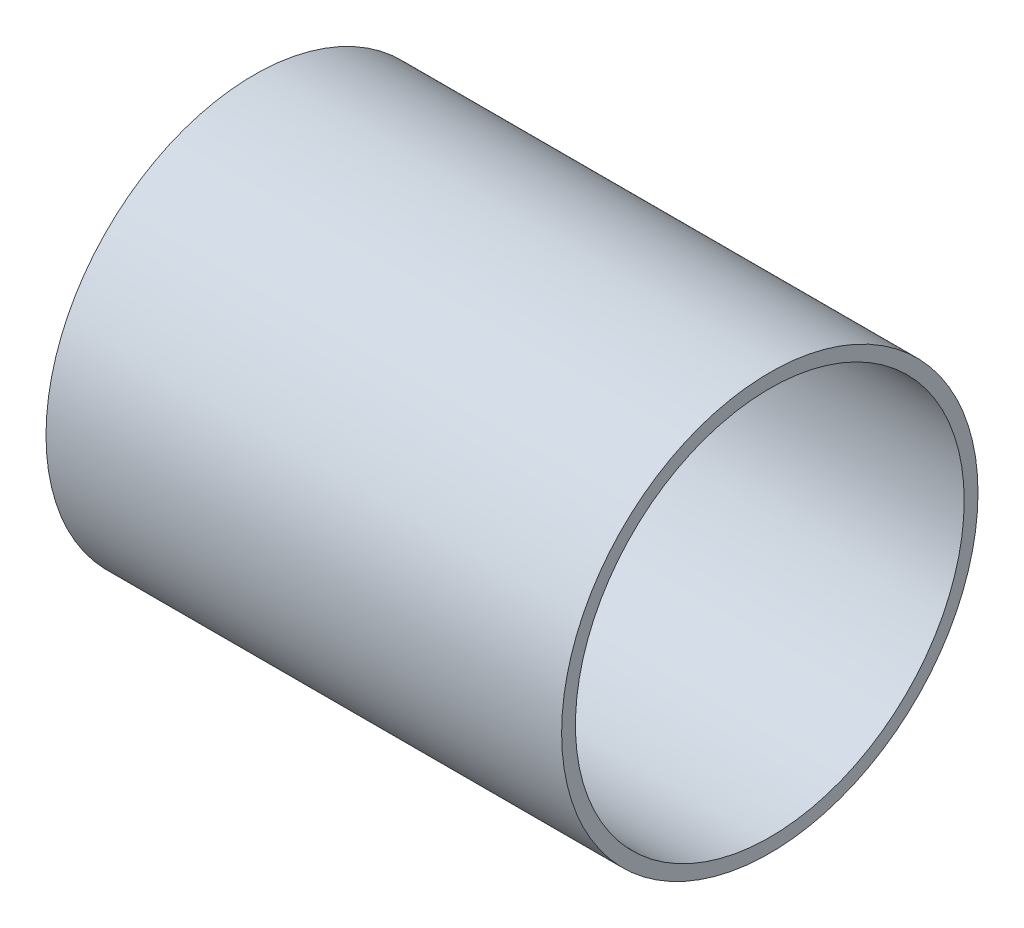
ISO-10303-21;
HEADER;
FILE_DESCRIPTION(('STEP AP214'),'2;1');
FILE_NAME('part.step','',(''),(''),'','','');
FILE_SCHEMA(('AUTOMOTIVE_DESIGN { 1 0 10303 214 1 1 1 1 }'));
ENDSEC;
DATA;
#1=APPLICATION_CONTEXT('core data for automotive mechanical design processes');
#2=APPLICATION_PROTOCOL_DEFINITION('international standard','automotive_design',2000,#1);
#3=PRODUCT_CONTEXT('',#1,'mechanical');
#4=PRODUCT('Part','Part','',(#3));
#5=PRODUCT_RELATED_PRODUCT_CATEGORY('part','',(#4));
#6=PRODUCT_DEFINITION_FORMATION('','',#4);
#7=PRODUCT_DEFINITION_CONTEXT('part definition',#1,'design');
#8=PRODUCT_DEFINITION('design','',#6,#7);
#9=PRODUCT_DEFINITION_SHAPE('','',#8);
#10=(LENGTH_UNIT() NAMED_UNIT(*) SI_UNIT(.MILLI.,.METRE.));
#11=(NAMED_UNIT(*) PLANE_ANGLE_UNIT() SI_UNIT($,.RADIAN.));
#12=(NAMED_UNIT(*) SI_UNIT($,.STERADIAN.) SOLID_ANGLE_UNIT());
#13=UNCERTAINTY_MEASURE_WITH_UNIT(LENGTH_MEASURE(1.E-05),#10,'distance_accuracy_value','');
#14=(GEOMETRIC_REPRESENTATION_CONTEXT(3) GLOBAL_UNCERTAINTY_ASSIGNED_CONTEXT((#13)) GLOBAL_UNIT_ASSIGNED_CONTEXT((#10,
#11,#12)) REPRESENTATION_CONTEXT('',''));
#15=CARTESIAN_POINT('',(0.,0.,0.));
#16=DIRECTION('',(0.,0.,1.));
#17=DIRECTION('',(1.,0.,0.));
#18=AXIS2_PLACEMENT_3D('',#15,#16,#17);
#19=CARTESIAN_POINT('',(100.092447703533,-151.764340658954,-22.0425890832619));
#20=DIRECTION('',(-1.,0.,0.));
#21=DIRECTION('',(0.,0.,1.));
#22=AXIS2_PLACEMENT_3D('',#19,#20,#21);
#23=CYLINDRICAL_SURFACE('',#22,7.58920613932454);
#24=CARTESIAN_POINT('',(81.2964477035325,-151.764340658954,-22.0425890832619));
#25=DIRECTION('',(-1.,0.,0.));
#26=DIRECTION('',(0.,0.,1.));
#27=AXIS2_PLACEMENT_3D('',#24,#25,#26);
#28=CIRCLE('',#27,7.58920613932454);
#29=CARTESIAN_POINT('',(81.2964477035325,-151.764340658954,-14.4533829439373));
#30=VERTEX_POINT('',#29);
#31=EDGE_CURVE('E19',#30,#30,#28,.T.);
#32=ORIENTED_EDGE('',*,*,#31,.F.);
#33=EDGE_LOOP('',(#32));
#34=FACE_BOUND('',#33,.T.);
#35=CARTESIAN_POINT('',(100.092447703533,-151.764340658954,-22.0425890832619));
#36=DIRECTION('',(-1.,0.,0.));
#37=DIRECTION('',(0.,0.,1.));
#38=AXIS2_PLACEMENT_3D('',#35,#36,#37);
#39=CIRCLE('',#38,7.58920613932454);
#40=CARTESIAN_POINT('',(100.092447703533,-151.764340658954,-14.4533829439373));
#41=VERTEX_POINT('',#40);
#42=EDGE_CURVE('E28',#41,#41,#39,.F.);
#43=ORIENTED_EDGE('',*,*,#42,.F.);
#44=EDGE_LOOP('',(#43));
#45=FACE_BOUND('',#44,.T.);
#46=ADVANCED_FACE('F15',(#34,#45),#23,.T.);
#47=CARTESIAN_POINT('',(81.2964477035325,-144.14973451963,-29.6571952225864));
#48=DIRECTION('',(-1.,0.,0.));
#49=DIRECTION('',(0.,-1.,0.));
#50=AXIS2_PLACEMENT_3D('',#47,#48,#49);
#51=PLANE('',#50);
#52=CARTESIAN_POINT('',(81.2964477035325,-151.764340658954,-22.0425890832619));
#53=DIRECTION('',(1.,0.,0.));
#54=DIRECTION('',(0.,0.,-1.));
#55=AXIS2_PLACEMENT_3D('',#52,#53,#54);
#56=CIRCLE('',#55,7.08601581282834);
#57=CARTESIAN_POINT('',(81.2964477035325,-151.764340658954,-29.1286048960902));
#58=VERTEX_POINT('',#57);
#59=EDGE_CURVE('E23',#58,#58,#56,.F.);
#60=ORIENTED_EDGE('',*,*,#59,.F.);
#61=EDGE_LOOP('',(#60));
#62=FACE_BOUND('',#61,.T.);
#63=ORIENTED_EDGE('',*,*,#31,.T.);
#64=EDGE_LOOP('',(#63));
#65=FACE_BOUND('',#64,.T.);
#66=ADVANCED_FACE('F36',(#62,#65),#51,.T.);
#67=CARTESIAN_POINT('',(100.092447703533,-159.378946798278,-29.6571952225864));
#68=DIRECTION('',(1.,0.,0.));
#69=DIRECTION('',(0.,1.,0.));
#70=AXIS2_PLACEMENT_3D('',#67,#68,#69);
#71=PLANE('',#70);
#72=CARTESIAN_POINT('',(100.092447703533,-151.764340658954,-22.0425890832619));
#73=DIRECTION('',(1.,0.,0.));
#74=DIRECTION('',(0.,0.,-1.));
#75=AXIS2_PLACEMENT_3D('',#72,#73,#74);
#76=CIRCLE('',#75,7.08601581282834);
#77=CARTESIAN_POINT('',(100.092447703533,-151.764340658954,-29.1286048960902));
#78=VERTEX_POINT('',#77);
#79=EDGE_CURVE('E10',#78,#78,#76,.T.);
#80=ORIENTED_EDGE('',*,*,#79,.F.);
#81=EDGE_LOOP('',(#80));
#82=FACE_BOUND('',#81,.T.);
#83=ORIENTED_EDGE('',*,*,#42,.T.);
#84=EDGE_LOOP('',(#83));
#85=FACE_BOUND('',#84,.T.);
#86=ADVANCED_FACE('F45',(#82,#85),#71,.T.);
#87=CARTESIAN_POINT('',(81.2964477035325,-151.764340658954,-22.0425890832619));
#88=DIRECTION('',(1.,0.,0.));
#89=DIRECTION('',(0.,0.,-1.));
#90=AXIS2_PLACEMENT_3D('',#87,#88,#89);
#91=CYLINDRICAL_SURFACE('',#90,7.08601581282834);
#92=ORIENTED_EDGE('',*,*,#79,.T.);
#93=EDGE_LOOP('',(#92));
#94=FACE_BOUND('',#93,.T.);
#95=ORIENTED_EDGE('',*,*,#59,.T.);
#96=EDGE_LOOP('',(#95));
#97=FACE_BOUND('',#96,.T.);
#98=ADVANCED_FACE('F17',(#94,#97),#91,.F.);
#99=CLOSED_SHELL('',(#46,#66,#86,#98));
#100=MANIFOLD_SOLID_BREP('B1',#99);
#101=ADVANCED_BREP_SHAPE_REPRESENTATION('',(#18,#100),#14);
#102=SHAPE_DEFINITION_REPRESENTATION(#9,#101);
ENDSEC;
END-ISO-10303-21;
